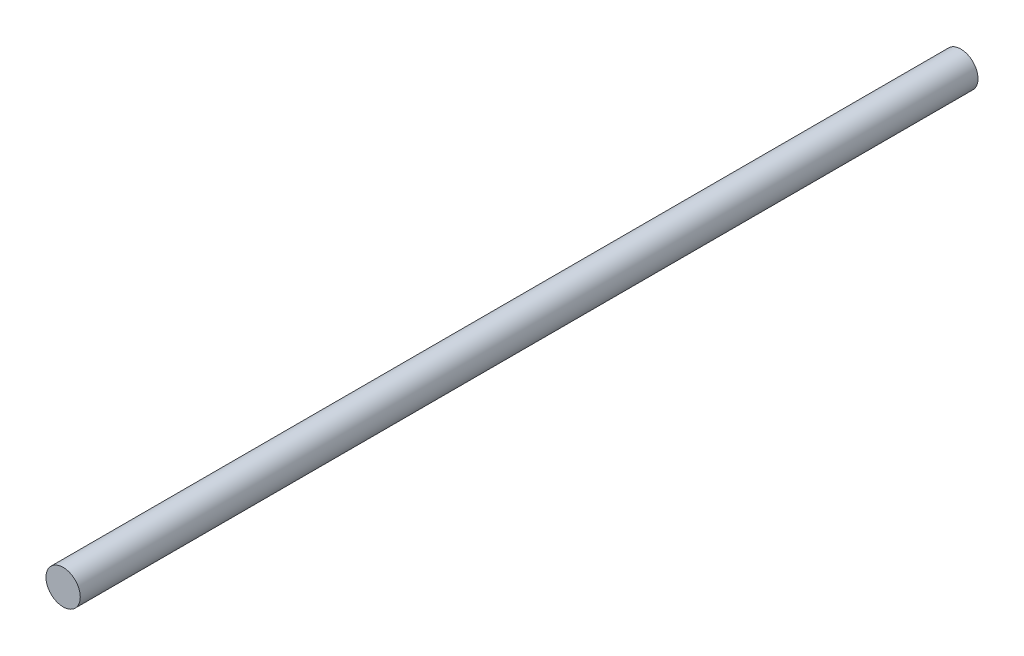
ISO-10303-21;
HEADER;
FILE_DESCRIPTION(('STEP AP214'),'2;1');
FILE_NAME('part.step','',(''),(''),'','','');
FILE_SCHEMA(('AUTOMOTIVE_DESIGN { 1 0 10303 214 1 1 1 1 }'));
ENDSEC;
DATA;
#1=APPLICATION_CONTEXT('core data for automotive mechanical design processes');
#2=APPLICATION_PROTOCOL_DEFINITION('international standard','automotive_design',2000,#1);
#3=PRODUCT_CONTEXT('',#1,'mechanical');
#4=PRODUCT('Part','Part','',(#3));
#5=PRODUCT_RELATED_PRODUCT_CATEGORY('part','',(#4));
#6=PRODUCT_DEFINITION_FORMATION('','',#4);
#7=PRODUCT_DEFINITION_CONTEXT('part definition',#1,'design');
#8=PRODUCT_DEFINITION('design','',#6,#7);
#9=PRODUCT_DEFINITION_SHAPE('','',#8);
#10=(LENGTH_UNIT() NAMED_UNIT(*) SI_UNIT(.MILLI.,.METRE.));
#11=(NAMED_UNIT(*) PLANE_ANGLE_UNIT() SI_UNIT($,.RADIAN.));
#12=(NAMED_UNIT(*) SI_UNIT($,.STERADIAN.) SOLID_ANGLE_UNIT());
#13=UNCERTAINTY_MEASURE_WITH_UNIT(LENGTH_MEASURE(1.E-05),#10,'distance_accuracy_value','');
#14=(GEOMETRIC_REPRESENTATION_CONTEXT(3) GLOBAL_UNCERTAINTY_ASSIGNED_CONTEXT((#13)) GLOBAL_UNIT_ASSIGNED_CONTEXT((#10,
#11,#12)) REPRESENTATION_CONTEXT('',''));
#15=CARTESIAN_POINT('',(0.,0.,0.));
#16=DIRECTION('',(0.,0.,1.));
#17=DIRECTION('',(1.,0.,0.));
#18=AXIS2_PLACEMENT_3D('',#15,#16,#17);
#19=CARTESIAN_POINT('',(0.,0.,157.));
#20=DIRECTION('',(0.,0.,-1.));
#21=DIRECTION('',(-1.,0.,0.));
#22=AXIS2_PLACEMENT_3D('',#19,#20,#21);
#23=CYLINDRICAL_SURFACE('',#22,3.);
#24=CARTESIAN_POINT('',(0.,0.,157.));
#25=DIRECTION('',(0.,0.,1.));
#26=DIRECTION('',(1.,0.,0.));
#27=AXIS2_PLACEMENT_3D('',#24,#25,#26);
#28=CIRCLE('',#27,3.);
#29=CARTESIAN_POINT('',(3.,0.,157.));
#30=VERTEX_POINT('',#29);
#31=EDGE_CURVE('E10',#30,#30,#28,.T.);
#32=ORIENTED_EDGE('',*,*,#31,.F.);
#33=EDGE_LOOP('',(#32));
#34=FACE_BOUND('',#33,.T.);
#35=CARTESIAN_POINT('',(0.,0.,0.));
#36=DIRECTION('',(0.,0.,1.));
#37=DIRECTION('',(1.,0.,0.));
#38=AXIS2_PLACEMENT_3D('',#35,#36,#37);
#39=CIRCLE('',#38,3.);
#40=CARTESIAN_POINT('',(3.,0.,0.));
#41=VERTEX_POINT('',#40);
#42=EDGE_CURVE('E41',#41,#41,#39,.T.);
#43=ORIENTED_EDGE('',*,*,#42,.T.);
#44=EDGE_LOOP('',(#43));
#45=FACE_BOUND('',#44,.T.);
#46=ADVANCED_FACE('F38',(#34,#45),#23,.T.);
#47=CARTESIAN_POINT('',(0.,0.,157.));
#48=DIRECTION('',(0.,0.,1.));
#49=DIRECTION('',(1.,0.,0.));
#50=AXIS2_PLACEMENT_3D('',#47,#48,#49);
#51=PLANE('',#50);
#52=ORIENTED_EDGE('',*,*,#31,.T.);
#53=EDGE_LOOP('',(#52));
#54=FACE_BOUND('',#53,.T.);
#55=ADVANCED_FACE('F53',(#54),#51,.T.);
#56=CARTESIAN_POINT('',(0.,0.,0.));
#57=DIRECTION('',(0.,0.,1.));
#58=DIRECTION('',(1.,0.,0.));
#59=AXIS2_PLACEMENT_3D('',#56,#57,#58);
#60=PLANE('',#59);
#61=ORIENTED_EDGE('',*,*,#42,.F.);
#62=EDGE_LOOP('',(#61));
#63=FACE_BOUND('',#62,.T.);
#64=ADVANCED_FACE('F51',(#63),#60,.F.);
#65=CLOSED_SHELL('',(#46,#55,#64));
#66=MANIFOLD_SOLID_BREP('B2',#65);
#67=ADVANCED_BREP_SHAPE_REPRESENTATION('',(#18,#66),#14);
#68=SHAPE_DEFINITION_REPRESENTATION(#9,#67);
ENDSEC;
END-ISO-10303-21;
